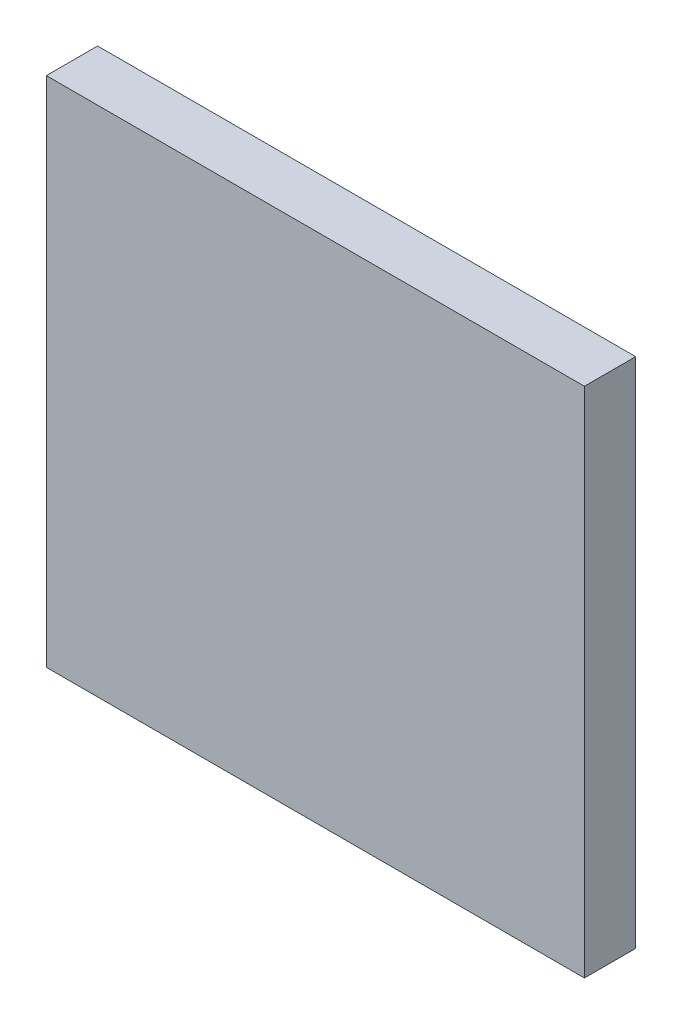
ISO-10303-21;
HEADER;
FILE_DESCRIPTION(('STEP AP214'),'2;1');
FILE_NAME('part.step','',(''),(''),'','','');
FILE_SCHEMA(('AUTOMOTIVE_DESIGN { 1 0 10303 214 1 1 1 1 }'));
ENDSEC;
DATA;
#1=APPLICATION_CONTEXT('core data for automotive mechanical design processes');
#2=APPLICATION_PROTOCOL_DEFINITION('international standard','automotive_design',2000,#1);
#3=PRODUCT_CONTEXT('',#1,'mechanical');
#4=PRODUCT('Part','Part','',(#3));
#5=PRODUCT_RELATED_PRODUCT_CATEGORY('part','',(#4));
#6=PRODUCT_DEFINITION_FORMATION('','',#4);
#7=PRODUCT_DEFINITION_CONTEXT('part definition',#1,'design');
#8=PRODUCT_DEFINITION('design','',#6,#7);
#9=PRODUCT_DEFINITION_SHAPE('','',#8);
#10=(LENGTH_UNIT() NAMED_UNIT(*) SI_UNIT(.MILLI.,.METRE.));
#11=(NAMED_UNIT(*) PLANE_ANGLE_UNIT() SI_UNIT($,.RADIAN.));
#12=(NAMED_UNIT(*) SI_UNIT($,.STERADIAN.) SOLID_ANGLE_UNIT());
#13=UNCERTAINTY_MEASURE_WITH_UNIT(LENGTH_MEASURE(1.E-05),#10,'distance_accuracy_value','');
#14=(GEOMETRIC_REPRESENTATION_CONTEXT(3) GLOBAL_UNCERTAINTY_ASSIGNED_CONTEXT((#13)) GLOBAL_UNIT_ASSIGNED_CONTEXT((#10,
#11,#12)) REPRESENTATION_CONTEXT('',''));
#15=CARTESIAN_POINT('',(0.,0.,0.));
#16=DIRECTION('',(0.,0.,1.));
#17=DIRECTION('',(1.,0.,0.));
#18=AXIS2_PLACEMENT_3D('',#15,#16,#17);
#19=CARTESIAN_POINT('',(0.,0.,100.));
#20=DIRECTION('',(1.,0.,0.));
#21=DIRECTION('',(0.,0.,-1.));
#22=AXIS2_PLACEMENT_3D('',#19,#20,#21);
#23=PLANE('',#22);
#24=DIRECTION('',(0.,-1.,0.));
#25=VECTOR('',#24,1.);
#26=CARTESIAN_POINT('',(0.,0.,0.));
#27=LINE('',#26,#25);
#28=CARTESIAN_POINT('',(0.,0.,0.));
#29=VERTEX_POINT('',#28);
#30=CARTESIAN_POINT('',(0.,-1000.,0.));
#31=VERTEX_POINT('',#30);
#32=EDGE_CURVE('E96',#29,#31,#27,.T.);
#33=ORIENTED_EDGE('',*,*,#32,.T.);
#34=DIRECTION('',(0.,0.,-1.));
#35=VECTOR('',#34,1.);
#36=CARTESIAN_POINT('',(0.,-1000.,100.));
#37=LINE('',#36,#35);
#38=CARTESIAN_POINT('',(0.,-1000.,100.));
#39=VERTEX_POINT('',#38);
#40=EDGE_CURVE('E11',#39,#31,#37,.T.);
#41=ORIENTED_EDGE('',*,*,#40,.F.);
#42=DIRECTION('',(0.,-1.,0.));
#43=VECTOR('',#42,1.);
#44=CARTESIAN_POINT('',(0.,0.,100.));
#45=LINE('',#44,#43);
#46=CARTESIAN_POINT('',(0.,0.,100.));
#47=VERTEX_POINT('',#46);
#48=EDGE_CURVE('E84',#47,#39,#45,.T.);
#49=ORIENTED_EDGE('',*,*,#48,.F.);
#50=DIRECTION('',(0.,0.,-1.));
#51=VECTOR('',#50,1.);
#52=CARTESIAN_POINT('',(0.,0.,100.));
#53=LINE('',#52,#51);
#54=EDGE_CURVE('E92',#47,#29,#53,.T.);
#55=ORIENTED_EDGE('',*,*,#54,.T.);
#56=EDGE_LOOP('',(#33,#41,#49,#55));
#57=FACE_BOUND('',#56,.T.);
#58=ADVANCED_FACE('F33',(#57),#23,.F.);
#59=CARTESIAN_POINT('',(0.,-1000.,100.));
#60=DIRECTION('',(0.,1.,0.));
#61=DIRECTION('',(0.,0.,1.));
#62=AXIS2_PLACEMENT_3D('',#59,#60,#61);
#63=PLANE('',#62);
#64=DIRECTION('',(1.,0.,0.));
#65=VECTOR('',#64,1.);
#66=CARTESIAN_POINT('',(0.,-1000.,0.));
#67=LINE('',#66,#65);
#68=CARTESIAN_POINT('',(1050.,-1000.,0.));
#69=VERTEX_POINT('',#68);
#70=EDGE_CURVE('E88',#31,#69,#67,.T.);
#71=ORIENTED_EDGE('',*,*,#70,.T.);
#72=DIRECTION('',(0.,0.,-1.));
#73=VECTOR('',#72,1.);
#74=CARTESIAN_POINT('',(1050.,-1000.,100.));
#75=LINE('',#74,#73);
#76=CARTESIAN_POINT('',(1050.,-1000.,100.));
#77=VERTEX_POINT('',#76);
#78=EDGE_CURVE('E41',#77,#69,#75,.T.);
#79=ORIENTED_EDGE('',*,*,#78,.F.);
#80=DIRECTION('',(1.,0.,0.));
#81=VECTOR('',#80,1.);
#82=CARTESIAN_POINT('',(0.,-1000.,100.));
#83=LINE('',#82,#81);
#84=EDGE_CURVE('E79',#39,#77,#83,.T.);
#85=ORIENTED_EDGE('',*,*,#84,.F.);
#86=ORIENTED_EDGE('',*,*,#40,.T.);
#87=EDGE_LOOP('',(#71,#79,#85,#86));
#88=FACE_BOUND('',#87,.T.);
#89=ADVANCED_FACE('F87',(#88),#63,.F.);
#90=CARTESIAN_POINT('',(1050.,0.,100.));
#91=DIRECTION('',(-1.,0.,0.));
#92=DIRECTION('',(0.,0.,1.));
#93=AXIS2_PLACEMENT_3D('',#90,#91,#92);
#94=PLANE('',#93);
#95=DIRECTION('',(0.,1.,0.));
#96=VECTOR('',#95,1.);
#97=CARTESIAN_POINT('',(1050.,0.,0.));
#98=LINE('',#97,#96);
#99=CARTESIAN_POINT('',(1050.,0.,0.));
#100=VERTEX_POINT('',#99);
#101=EDGE_CURVE('E66',#69,#100,#98,.T.);
#102=ORIENTED_EDGE('',*,*,#101,.T.);
#103=DIRECTION('',(0.,0.,-1.));
#104=VECTOR('',#103,1.);
#105=CARTESIAN_POINT('',(1050.,0.,100.));
#106=LINE('',#105,#104);
#107=CARTESIAN_POINT('',(1050.,0.,100.));
#108=VERTEX_POINT('',#107);
#109=EDGE_CURVE('E89',#108,#100,#106,.T.);
#110=ORIENTED_EDGE('',*,*,#109,.F.);
#111=DIRECTION('',(0.,1.,0.));
#112=VECTOR('',#111,1.);
#113=CARTESIAN_POINT('',(1050.,0.,100.));
#114=LINE('',#113,#112);
#115=EDGE_CURVE('E82',#77,#108,#114,.T.);
#116=ORIENTED_EDGE('',*,*,#115,.F.);
#117=ORIENTED_EDGE('',*,*,#78,.T.);
#118=EDGE_LOOP('',(#102,#110,#116,#117));
#119=FACE_BOUND('',#118,.T.);
#120=ADVANCED_FACE('F90',(#119),#94,.F.);
#121=CARTESIAN_POINT('',(0.,0.,100.));
#122=DIRECTION('',(0.,-1.,0.));
#123=DIRECTION('',(0.,0.,-1.));
#124=AXIS2_PLACEMENT_3D('',#121,#122,#123);
#125=PLANE('',#124);
#126=DIRECTION('',(-1.,0.,0.));
#127=VECTOR('',#126,1.);
#128=CARTESIAN_POINT('',(0.,0.,0.));
#129=LINE('',#128,#127);
#130=EDGE_CURVE('E72',#100,#29,#129,.T.);
#131=ORIENTED_EDGE('',*,*,#130,.T.);
#132=ORIENTED_EDGE('',*,*,#54,.F.);
#133=DIRECTION('',(-1.,0.,0.));
#134=VECTOR('',#133,1.);
#135=CARTESIAN_POINT('',(0.,0.,100.));
#136=LINE('',#135,#134);
#137=EDGE_CURVE('E49',#108,#47,#136,.T.);
#138=ORIENTED_EDGE('',*,*,#137,.F.);
#139=ORIENTED_EDGE('',*,*,#109,.T.);
#140=EDGE_LOOP('',(#131,#132,#138,#139));
#141=FACE_BOUND('',#140,.T.);
#142=ADVANCED_FACE('F103',(#141),#125,.F.);
#143=CARTESIAN_POINT('',(0.,0.,100.));
#144=DIRECTION('',(0.,0.,1.));
#145=DIRECTION('',(1.,0.,0.));
#146=AXIS2_PLACEMENT_3D('',#143,#144,#145);
#147=PLANE('',#146);
#148=ORIENTED_EDGE('',*,*,#48,.T.);
#149=ORIENTED_EDGE('',*,*,#84,.T.);
#150=ORIENTED_EDGE('',*,*,#115,.T.);
#151=ORIENTED_EDGE('',*,*,#137,.T.);
#152=EDGE_LOOP('',(#148,#149,#150,#151));
#153=FACE_BOUND('',#152,.T.);
#154=ADVANCED_FACE('F80',(#153),#147,.T.);
#155=CARTESIAN_POINT('',(0.,0.,0.));
#156=DIRECTION('',(0.,0.,1.));
#157=DIRECTION('',(1.,0.,0.));
#158=AXIS2_PLACEMENT_3D('',#155,#156,#157);
#159=PLANE('',#158);
#160=ORIENTED_EDGE('',*,*,#32,.F.);
#161=ORIENTED_EDGE('',*,*,#130,.F.);
#162=ORIENTED_EDGE('',*,*,#101,.F.);
#163=ORIENTED_EDGE('',*,*,#70,.F.);
#164=EDGE_LOOP('',(#160,#161,#162,#163));
#165=FACE_BOUND('',#164,.T.);
#166=ADVANCED_FACE('F106',(#165),#159,.F.);
#167=CLOSED_SHELL('',(#58,#89,#120,#142,#154,#166));
#168=MANIFOLD_SOLID_BREP('B2',#167);
#169=ADVANCED_BREP_SHAPE_REPRESENTATION('',(#18,#168),#14);
#170=SHAPE_DEFINITION_REPRESENTATION(#9,#169);
ENDSEC;
END-ISO-10303-21;
